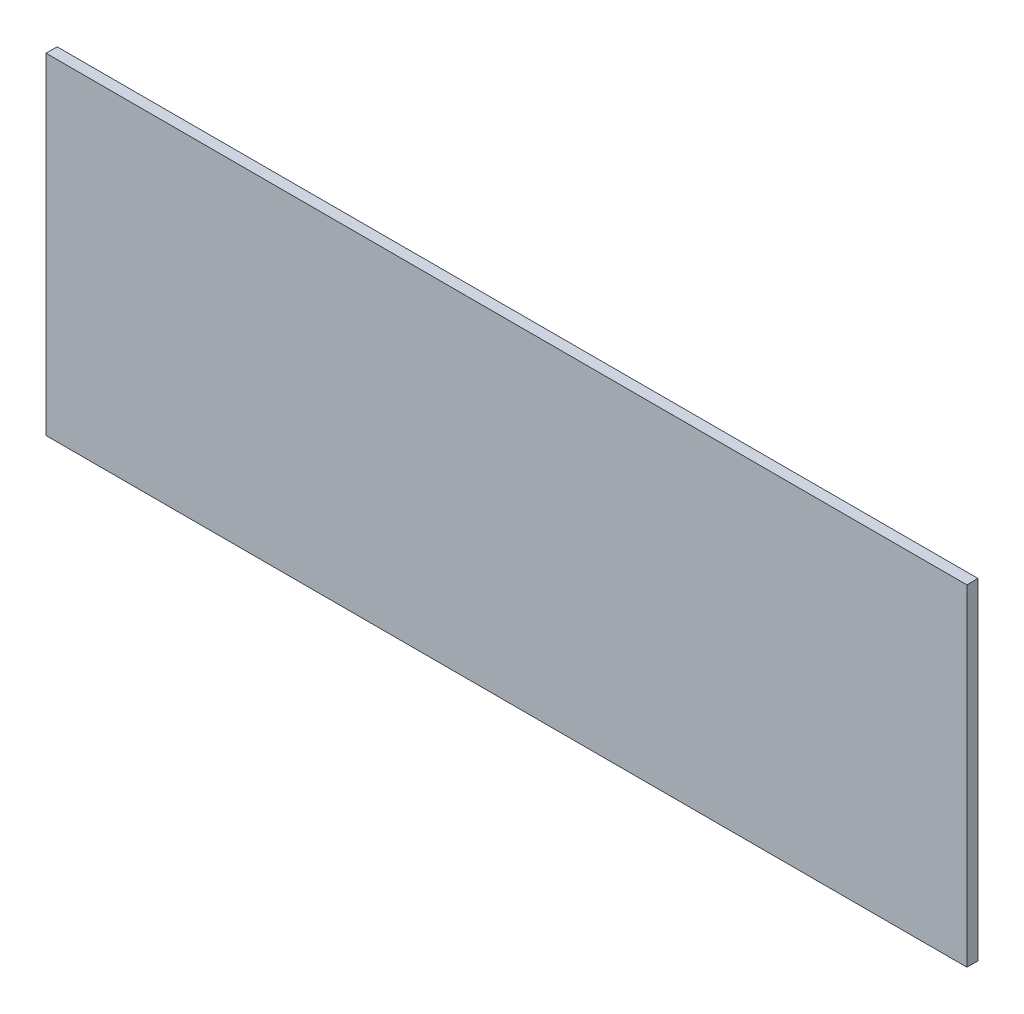
ISO-10303-21;
HEADER;
FILE_DESCRIPTION(('STEP AP214'),'2;1');
FILE_NAME('part.step','',(''),(''),'','','');
FILE_SCHEMA(('AUTOMOTIVE_DESIGN { 1 0 10303 214 1 1 1 1 }'));
ENDSEC;
DATA;
#1=APPLICATION_CONTEXT('core data for automotive mechanical design processes');
#2=APPLICATION_PROTOCOL_DEFINITION('international standard','automotive_design',2000,#1);
#3=PRODUCT_CONTEXT('',#1,'mechanical');
#4=PRODUCT('Part','Part','',(#3));
#5=PRODUCT_RELATED_PRODUCT_CATEGORY('part','',(#4));
#6=PRODUCT_DEFINITION_FORMATION('','',#4);
#7=PRODUCT_DEFINITION_CONTEXT('part definition',#1,'design');
#8=PRODUCT_DEFINITION('design','',#6,#7);
#9=PRODUCT_DEFINITION_SHAPE('','',#8);
#10=(LENGTH_UNIT() NAMED_UNIT(*) SI_UNIT(.MILLI.,.METRE.));
#11=(NAMED_UNIT(*) PLANE_ANGLE_UNIT() SI_UNIT($,.RADIAN.));
#12=(NAMED_UNIT(*) SI_UNIT($,.STERADIAN.) SOLID_ANGLE_UNIT());
#13=UNCERTAINTY_MEASURE_WITH_UNIT(LENGTH_MEASURE(1.E-05),#10,'distance_accuracy_value','');
#14=(GEOMETRIC_REPRESENTATION_CONTEXT(3) GLOBAL_UNCERTAINTY_ASSIGNED_CONTEXT((#13)) GLOBAL_UNIT_ASSIGNED_CONTEXT((#10,
#11,#12)) REPRESENTATION_CONTEXT('',''));
#15=CARTESIAN_POINT('',(0.,0.,0.));
#16=DIRECTION('',(0.,0.,1.));
#17=DIRECTION('',(1.,0.,0.));
#18=AXIS2_PLACEMENT_3D('',#15,#16,#17);
#19=CARTESIAN_POINT('',(231.775,83.34375,5.588));
#20=DIRECTION('',(-1.,0.,0.));
#21=DIRECTION('',(0.,-1.,0.));
#22=AXIS2_PLACEMENT_3D('',#19,#20,#21);
#23=PLANE('',#22);
#24=DIRECTION('',(0.,1.,0.));
#25=VECTOR('',#24,1.);
#26=CARTESIAN_POINT('',(231.775,83.34375,0.));
#27=LINE('',#26,#25);
#28=CARTESIAN_POINT('',(231.775,-83.34375,0.));
#29=VERTEX_POINT('',#28);
#30=CARTESIAN_POINT('',(231.775,83.34375,0.));
#31=VERTEX_POINT('',#30);
#32=EDGE_CURVE('E95',#29,#31,#27,.T.);
#33=ORIENTED_EDGE('',*,*,#32,.T.);
#34=DIRECTION('',(0.,0.,-1.));
#35=VECTOR('',#34,1.);
#36=CARTESIAN_POINT('',(231.775,83.34375,5.588));
#37=LINE('',#36,#35);
#38=CARTESIAN_POINT('',(231.775,83.34375,5.588));
#39=VERTEX_POINT('',#38);
#40=EDGE_CURVE('E11',#39,#31,#37,.T.);
#41=ORIENTED_EDGE('',*,*,#40,.F.);
#42=DIRECTION('',(0.,1.,0.));
#43=VECTOR('',#42,1.);
#44=CARTESIAN_POINT('',(231.775,83.34375,5.588));
#45=LINE('',#44,#43);
#46=CARTESIAN_POINT('',(231.775,-83.34375,5.588));
#47=VERTEX_POINT('',#46);
#48=EDGE_CURVE('E83',#47,#39,#45,.T.);
#49=ORIENTED_EDGE('',*,*,#48,.F.);
#50=DIRECTION('',(0.,0.,-1.));
#51=VECTOR('',#50,1.);
#52=CARTESIAN_POINT('',(231.775,-83.34375,5.588));
#53=LINE('',#52,#51);
#54=EDGE_CURVE('E91',#47,#29,#53,.T.);
#55=ORIENTED_EDGE('',*,*,#54,.T.);
#56=EDGE_LOOP('',(#33,#41,#49,#55));
#57=FACE_BOUND('',#56,.T.);
#58=ADVANCED_FACE('F32',(#57),#23,.F.);
#59=CARTESIAN_POINT('',(-231.775,83.34375,5.588));
#60=DIRECTION('',(0.,-1.,0.));
#61=DIRECTION('',(0.,0.,-1.));
#62=AXIS2_PLACEMENT_3D('',#59,#60,#61);
#63=PLANE('',#62);
#64=DIRECTION('',(-1.,0.,0.));
#65=VECTOR('',#64,1.);
#66=CARTESIAN_POINT('',(-231.775,83.34375,0.));
#67=LINE('',#66,#65);
#68=CARTESIAN_POINT('',(-231.775,83.34375,0.));
#69=VERTEX_POINT('',#68);
#70=EDGE_CURVE('E87',#31,#69,#67,.T.);
#71=ORIENTED_EDGE('',*,*,#70,.T.);
#72=DIRECTION('',(0.,0.,-1.));
#73=VECTOR('',#72,1.);
#74=CARTESIAN_POINT('',(-231.775,83.34375,5.588));
#75=LINE('',#74,#73);
#76=CARTESIAN_POINT('',(-231.775,83.34375,5.588));
#77=VERTEX_POINT('',#76);
#78=EDGE_CURVE('E40',#77,#69,#75,.T.);
#79=ORIENTED_EDGE('',*,*,#78,.F.);
#80=DIRECTION('',(-1.,0.,0.));
#81=VECTOR('',#80,1.);
#82=CARTESIAN_POINT('',(-231.775,83.34375,5.588));
#83=LINE('',#82,#81);
#84=EDGE_CURVE('E78',#39,#77,#83,.T.);
#85=ORIENTED_EDGE('',*,*,#84,.F.);
#86=ORIENTED_EDGE('',*,*,#40,.T.);
#87=EDGE_LOOP('',(#71,#79,#85,#86));
#88=FACE_BOUND('',#87,.T.);
#89=ADVANCED_FACE('F86',(#88),#63,.F.);
#90=CARTESIAN_POINT('',(-231.775,83.34375,5.588));
#91=DIRECTION('',(1.,0.,0.));
#92=DIRECTION('',(0.,1.,0.));
#93=AXIS2_PLACEMENT_3D('',#90,#91,#92);
#94=PLANE('',#93);
#95=DIRECTION('',(0.,-1.,0.));
#96=VECTOR('',#95,1.);
#97=CARTESIAN_POINT('',(-231.775,83.34375,0.));
#98=LINE('',#97,#96);
#99=CARTESIAN_POINT('',(-231.775,-83.34375,0.));
#100=VERTEX_POINT('',#99);
#101=EDGE_CURVE('E65',#69,#100,#98,.T.);
#102=ORIENTED_EDGE('',*,*,#101,.T.);
#103=DIRECTION('',(0.,0.,-1.));
#104=VECTOR('',#103,1.);
#105=CARTESIAN_POINT('',(-231.775,-83.34375,5.588));
#106=LINE('',#105,#104);
#107=CARTESIAN_POINT('',(-231.775,-83.34375,5.588));
#108=VERTEX_POINT('',#107);
#109=EDGE_CURVE('E88',#108,#100,#106,.T.);
#110=ORIENTED_EDGE('',*,*,#109,.F.);
#111=DIRECTION('',(0.,-1.,0.));
#112=VECTOR('',#111,1.);
#113=CARTESIAN_POINT('',(-231.775,83.34375,5.588));
#114=LINE('',#113,#112);
#115=EDGE_CURVE('E81',#77,#108,#114,.T.);
#116=ORIENTED_EDGE('',*,*,#115,.F.);
#117=ORIENTED_EDGE('',*,*,#78,.T.);
#118=EDGE_LOOP('',(#102,#110,#116,#117));
#119=FACE_BOUND('',#118,.T.);
#120=ADVANCED_FACE('F89',(#119),#94,.F.);
#121=CARTESIAN_POINT('',(-231.775,-83.34375,5.588));
#122=DIRECTION('',(0.,1.,0.));
#123=DIRECTION('',(0.,0.,1.));
#124=AXIS2_PLACEMENT_3D('',#121,#122,#123);
#125=PLANE('',#124);
#126=DIRECTION('',(1.,0.,0.));
#127=VECTOR('',#126,1.);
#128=CARTESIAN_POINT('',(-231.775,-83.34375,0.));
#129=LINE('',#128,#127);
#130=EDGE_CURVE('E71',#100,#29,#129,.T.);
#131=ORIENTED_EDGE('',*,*,#130,.T.);
#132=ORIENTED_EDGE('',*,*,#54,.F.);
#133=DIRECTION('',(1.,0.,0.));
#134=VECTOR('',#133,1.);
#135=CARTESIAN_POINT('',(-231.775,-83.34375,5.588));
#136=LINE('',#135,#134);
#137=EDGE_CURVE('E48',#108,#47,#136,.T.);
#138=ORIENTED_EDGE('',*,*,#137,.F.);
#139=ORIENTED_EDGE('',*,*,#109,.T.);
#140=EDGE_LOOP('',(#131,#132,#138,#139));
#141=FACE_BOUND('',#140,.T.);
#142=ADVANCED_FACE('F102',(#141),#125,.F.);
#143=CARTESIAN_POINT('',(0.,0.,5.588));
#144=DIRECTION('',(0.,0.,1.));
#145=DIRECTION('',(1.,0.,0.));
#146=AXIS2_PLACEMENT_3D('',#143,#144,#145);
#147=PLANE('',#146);
#148=ORIENTED_EDGE('',*,*,#48,.T.);
#149=ORIENTED_EDGE('',*,*,#84,.T.);
#150=ORIENTED_EDGE('',*,*,#115,.T.);
#151=ORIENTED_EDGE('',*,*,#137,.T.);
#152=EDGE_LOOP('',(#148,#149,#150,#151));
#153=FACE_BOUND('',#152,.T.);
#154=ADVANCED_FACE('F79',(#153),#147,.T.);
#155=CARTESIAN_POINT('',(0.,0.,0.));
#156=DIRECTION('',(0.,0.,1.));
#157=DIRECTION('',(1.,0.,0.));
#158=AXIS2_PLACEMENT_3D('',#155,#156,#157);
#159=PLANE('',#158);
#160=ORIENTED_EDGE('',*,*,#32,.F.);
#161=ORIENTED_EDGE('',*,*,#130,.F.);
#162=ORIENTED_EDGE('',*,*,#101,.F.);
#163=ORIENTED_EDGE('',*,*,#70,.F.);
#164=EDGE_LOOP('',(#160,#161,#162,#163));
#165=FACE_BOUND('',#164,.T.);
#166=ADVANCED_FACE('F105',(#165),#159,.F.);
#167=CLOSED_SHELL('',(#58,#89,#120,#142,#154,#166));
#168=MANIFOLD_SOLID_BREP('B2',#167);
#169=ADVANCED_BREP_SHAPE_REPRESENTATION('',(#18,#168),#14);
#170=SHAPE_DEFINITION_REPRESENTATION(#9,#169);
ENDSEC;
END-ISO-10303-21;
